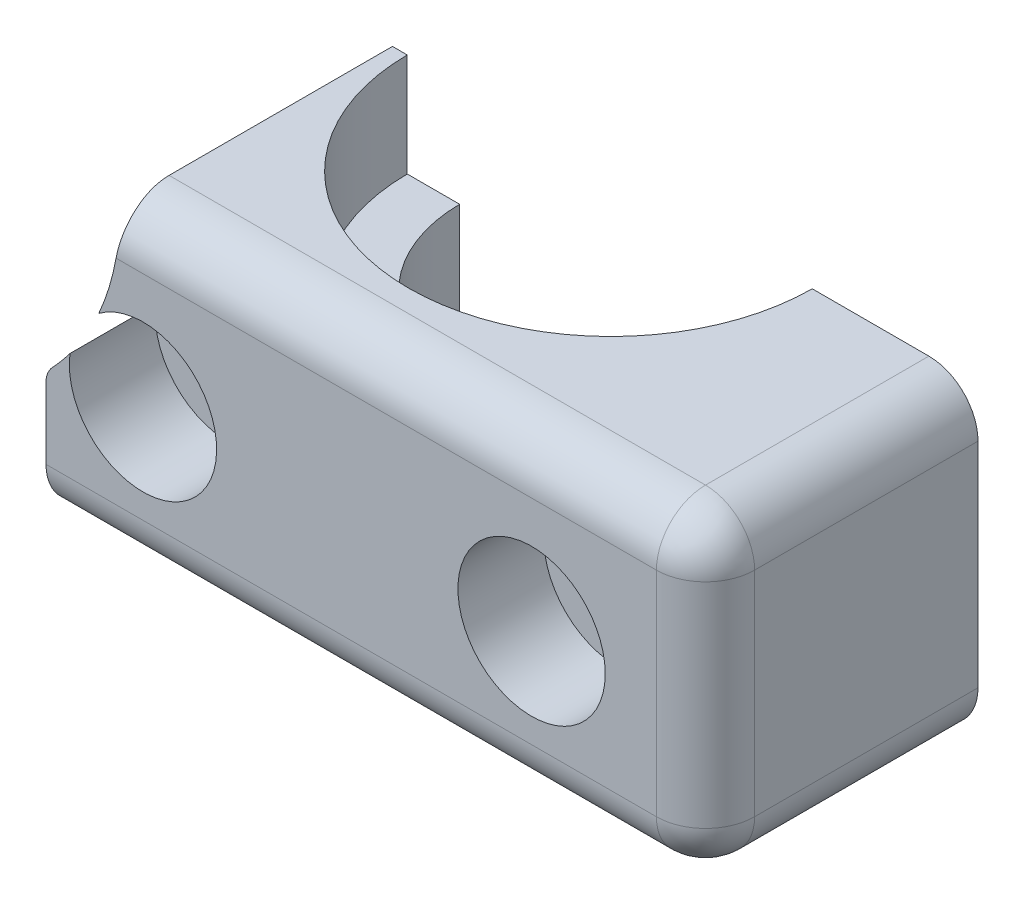
ISO-10303-21;
HEADER;
FILE_DESCRIPTION(('STEP AP214'),'2;1');
FILE_NAME('part.step','',(''),(''),'','','');
FILE_SCHEMA(('AUTOMOTIVE_DESIGN { 1 0 10303 214 1 1 1 1 }'));
ENDSEC;
DATA;
#1=APPLICATION_CONTEXT('core data for automotive mechanical design processes');
#2=APPLICATION_PROTOCOL_DEFINITION('international standard','automotive_design',2000,#1);
#3=PRODUCT_CONTEXT('',#1,'mechanical');
#4=PRODUCT('Part','Part','',(#3));
#5=PRODUCT_RELATED_PRODUCT_CATEGORY('part','',(#4));
#6=PRODUCT_DEFINITION_FORMATION('','',#4);
#7=PRODUCT_DEFINITION_CONTEXT('part definition',#1,'design');
#8=PRODUCT_DEFINITION('design','',#6,#7);
#9=PRODUCT_DEFINITION_SHAPE('','',#8);
#10=(LENGTH_UNIT() NAMED_UNIT(*) SI_UNIT(.MILLI.,.METRE.));
#11=(NAMED_UNIT(*) PLANE_ANGLE_UNIT() SI_UNIT($,.RADIAN.));
#12=(NAMED_UNIT(*) SI_UNIT($,.STERADIAN.) SOLID_ANGLE_UNIT());
#13=UNCERTAINTY_MEASURE_WITH_UNIT(LENGTH_MEASURE(1.E-05),#10,'distance_accuracy_value','');
#14=(GEOMETRIC_REPRESENTATION_CONTEXT(3) GLOBAL_UNCERTAINTY_ASSIGNED_CONTEXT((#13)) GLOBAL_UNIT_ASSIGNED_CONTEXT((#10,
#11,#12)) REPRESENTATION_CONTEXT('',''));
#15=CARTESIAN_POINT('',(0.,0.,0.));
#16=DIRECTION('',(0.,0.,1.));
#17=DIRECTION('',(1.,0.,0.));
#18=AXIS2_PLACEMENT_3D('',#15,#16,#17);
#19=CARTESIAN_POINT('',(4.42655787969391,-17.5520097629016,27.2355834067228));
#20=DIRECTION('',(0.,1.,0.));
#21=DIRECTION('',(0.,0.,1.));
#22=AXIS2_PLACEMENT_3D('',#19,#20,#21);
#23=CYLINDRICAL_SURFACE('',#22,6.1162230795646);
#24=DIRECTION('',(0.,1.,0.));
#25=VECTOR('',#24,1.);
#26=CARTESIAN_POINT('',(10.5425765813493,-17.5520097629016,27.2855834067228));
#27=LINE('',#26,#25);
#28=CARTESIAN_POINT('',(10.5425765813493,10.7825140162545,27.2855834067228));
#29=VERTEX_POINT('',#28);
#30=CARTESIAN_POINT('',(10.5425765813493,5.78251401625446,27.2855834067229));
#31=VERTEX_POINT('',#30);
#32=EDGE_CURVE('E301',#29,#31,#27,.F.);
#33=ORIENTED_EDGE('',*,*,#32,.T.);
#34=CARTESIAN_POINT('',(4.42655787969391,5.78251401625446,27.2355834067229));
#35=DIRECTION('',(0.,-1.,0.));
#36=DIRECTION('',(0.,0.,-1.));
#37=AXIS2_PLACEMENT_3D('',#34,#35,#36);
#38=CIRCLE('',#37,6.1162230795646);
#39=CARTESIAN_POINT('',(-1.68946082196149,5.78251401625446,27.2855834067229));
#40=VERTEX_POINT('',#39);
#41=EDGE_CURVE('E48',#31,#40,#38,.T.);
#42=ORIENTED_EDGE('',*,*,#41,.T.);
#43=DIRECTION('',(0.,1.,0.));
#44=VECTOR('',#43,1.);
#45=CARTESIAN_POINT('',(-1.68946082196149,-17.5520097629016,27.2855834067228));
#46=LINE('',#45,#44);
#47=CARTESIAN_POINT('',(-1.68946082196149,10.7825140162545,27.2855834067228));
#48=VERTEX_POINT('',#47);
#49=EDGE_CURVE('E292',#40,#48,#46,.T.);
#50=ORIENTED_EDGE('',*,*,#49,.T.);
#51=CARTESIAN_POINT('',(4.42655787969391,10.7825140162545,27.2355834067229));
#52=DIRECTION('',(0.,-1.,0.));
#53=DIRECTION('',(0.,0.,-1.));
#54=AXIS2_PLACEMENT_3D('',#51,#52,#53);
#55=CIRCLE('',#54,6.1162230795646);
#56=EDGE_CURVE('E320',#29,#48,#55,.T.);
#57=ORIENTED_EDGE('',*,*,#56,.F.);
#58=EDGE_LOOP('',(#33,#42,#50,#57));
#59=FACE_BOUND('',#58,.T.);
#60=ADVANCED_FACE('F45',(#59),#23,.F.);
#61=CARTESIAN_POINT('',(0.,5.78251401625447,0.));
#62=DIRECTION('',(0.,1.,0.));
#63=DIRECTION('',(0.,0.,1.));
#64=AXIS2_PLACEMENT_3D('',#61,#62,#63);
#65=PLANE('',#64);
#66=ORIENTED_EDGE('',*,*,#41,.F.);
#67=DIRECTION('',(-1.,0.,0.));
#68=VECTOR('',#67,1.);
#69=CARTESIAN_POINT('',(0.,5.78251401625446,27.2855834067229));
#70=LINE('',#69,#68);
#71=CARTESIAN_POINT('',(12.676406363151,5.78251401625446,27.2855834067229));
#72=VERTEX_POINT('',#71);
#73=EDGE_CURVE('E244',#72,#31,#70,.T.);
#74=ORIENTED_EDGE('',*,*,#73,.F.);
#75=CARTESIAN_POINT('',(4.42655787969391,5.78251401625446,27.2355834067229));
#76=DIRECTION('',(0.,1.,0.));
#77=DIRECTION('',(0.,0.,1.));
#78=AXIS2_PLACEMENT_3D('',#75,#76,#77);
#79=CIRCLE('',#78,8.25);
#80=CARTESIAN_POINT('',(-3.82329060376322,5.78251401625446,27.2855834067229));
#81=VERTEX_POINT('',#80);
#82=EDGE_CURVE('E322',#81,#72,#79,.T.);
#83=ORIENTED_EDGE('',*,*,#82,.F.);
#84=EDGE_CURVE('E271',#40,#81,#70,.T.);
#85=ORIENTED_EDGE('',*,*,#84,.F.);
#86=EDGE_LOOP('',(#66,#74,#83,#85));
#87=FACE_BOUND('',#86,.T.);
#88=ADVANCED_FACE('F413',(#87),#65,.F.);
#89=CARTESIAN_POINT('',(12.3417710075974,8.28251401625447,34.8855834067228));
#90=DIRECTION('',(0.,0.,1.));
#91=DIRECTION('',(1.,0.,0.));
#92=AXIS2_PLACEMENT_3D('',#89,#90,#91);
#93=PLANE('',#92);
#94=CARTESIAN_POINT('',(12.3417710075974,8.28251401625447,34.8855834067228));
#95=DIRECTION('',(0.,0.,1.));
#96=DIRECTION('',(1.,0.,0.));
#97=AXIS2_PLACEMENT_3D('',#94,#95,#96);
#98=CIRCLE('',#97,3.);
#99=CARTESIAN_POINT('',(15.3417710075974,8.28251401625447,34.8855834067228));
#100=VERTEX_POINT('',#99);
#101=EDGE_CURVE('E294',#100,#100,#98,.T.);
#102=ORIENTED_EDGE('',*,*,#101,.T.);
#103=EDGE_LOOP('',(#102));
#104=FACE_BOUND('',#103,.T.);
#105=CARTESIAN_POINT('',(12.3417710075974,8.28251401625447,34.8855834067228));
#106=DIRECTION('',(0.,0.,1.));
#107=DIRECTION('',(1.,0.,0.));
#108=AXIS2_PLACEMENT_3D('',#105,#106,#107);
#109=CIRCLE('',#108,1.75);
#110=CARTESIAN_POINT('',(14.0917710075974,8.28251401625447,34.8855834067228));
#111=VERTEX_POINT('',#110);
#112=EDGE_CURVE('E299',#111,#111,#109,.F.);
#113=ORIENTED_EDGE('',*,*,#112,.T.);
#114=EDGE_LOOP('',(#113));
#115=FACE_BOUND('',#114,.T.);
#116=ADVANCED_FACE('F431',(#104,#115),#93,.T.);
#117=CARTESIAN_POINT('',(12.3417710075974,8.28251401625447,22.285835938417));
#118=DIRECTION('',(0.,0.,1.));
#119=DIRECTION('',(1.,0.,0.));
#120=AXIS2_PLACEMENT_3D('',#117,#118,#119);
#121=CYLINDRICAL_SURFACE('',#120,1.75);
#122=ORIENTED_EDGE('',*,*,#112,.F.);
#123=EDGE_LOOP('',(#122));
#124=FACE_BOUND('',#123,.T.);
#125=CARTESIAN_POINT('',(12.3417710075974,8.28251401625447,27.2855834067229));
#126=DIRECTION('',(0.,0.,-1.));
#127=DIRECTION('',(0.,1.,0.));
#128=AXIS2_PLACEMENT_3D('',#125,#126,#127);
#129=CIRCLE('',#128,1.75);
#130=CARTESIAN_POINT('',(12.3417710075974,10.0325140162545,27.2855834067229));
#131=VERTEX_POINT('',#130);
#132=EDGE_CURVE('E283',#131,#131,#129,.F.);
#133=ORIENTED_EDGE('',*,*,#132,.F.);
#134=EDGE_LOOP('',(#133));
#135=FACE_BOUND('',#134,.T.);
#136=ADVANCED_FACE('F435',(#124,#135),#121,.F.);
#137=CARTESIAN_POINT('',(12.3417710075974,8.28251401625447,34.8855834067228));
#138=DIRECTION('',(0.,0.,1.));
#139=DIRECTION('',(1.,0.,0.));
#140=AXIS2_PLACEMENT_3D('',#137,#138,#139);
#141=CYLINDRICAL_SURFACE('',#140,3.);
#142=ORIENTED_EDGE('',*,*,#101,.F.);
#143=EDGE_LOOP('',(#142));
#144=FACE_BOUND('',#143,.T.);
#145=CARTESIAN_POINT('',(12.3417710075974,8.28251401625447,38.3855834067229));
#146=DIRECTION('',(0.,0.,1.));
#147=DIRECTION('',(1.,0.,0.));
#148=AXIS2_PLACEMENT_3D('',#145,#146,#147);
#149=CIRCLE('',#148,3.);
#150=CARTESIAN_POINT('',(15.3417710075974,8.28251401625447,38.3855834067229));
#151=VERTEX_POINT('',#150);
#152=EDGE_CURVE('E338',#151,#151,#149,.T.);
#153=ORIENTED_EDGE('',*,*,#152,.T.);
#154=EDGE_LOOP('',(#153));
#155=FACE_BOUND('',#154,.T.);
#156=ADVANCED_FACE('F442',(#144,#155),#141,.F.);
#157=CARTESIAN_POINT('',(-3.48865524820903,8.28251401625447,22.285835938417));
#158=DIRECTION('',(0.,0.,1.));
#159=DIRECTION('',(1.,0.,0.));
#160=AXIS2_PLACEMENT_3D('',#157,#158,#159);
#161=CYLINDRICAL_SURFACE('',#160,1.75);
#162=CARTESIAN_POINT('',(-3.48865524820903,8.28251401625447,34.8855834067228));
#163=DIRECTION('',(0.,0.,1.));
#164=DIRECTION('',(1.,0.,0.));
#165=AXIS2_PLACEMENT_3D('',#162,#163,#164);
#166=CIRCLE('',#165,1.75);
#167=CARTESIAN_POINT('',(-1.73865524820903,8.28251401625447,34.8855834067228));
#168=VERTEX_POINT('',#167);
#169=EDGE_CURVE('E329',#168,#168,#166,.F.);
#170=ORIENTED_EDGE('',*,*,#169,.F.);
#171=EDGE_LOOP('',(#170));
#172=FACE_BOUND('',#171,.T.);
#173=CARTESIAN_POINT('',(-3.48865524820903,8.28251401625447,27.2855834067229));
#174=DIRECTION('',(0.,0.,-1.));
#175=DIRECTION('',(0.,1.,0.));
#176=AXIS2_PLACEMENT_3D('',#173,#174,#175);
#177=CIRCLE('',#176,1.75);
#178=CARTESIAN_POINT('',(-3.48865524820903,10.0325140162545,27.2855834067229));
#179=VERTEX_POINT('',#178);
#180=EDGE_CURVE('E208',#179,#179,#177,.F.);
#181=ORIENTED_EDGE('',*,*,#180,.F.);
#182=EDGE_LOOP('',(#181));
#183=FACE_BOUND('',#182,.T.);
#184=ADVANCED_FACE('F439',(#172,#183),#161,.F.);
#185=CARTESIAN_POINT('',(-3.48865524820903,8.28251401625447,34.8855834067228));
#186=DIRECTION('',(0.,0.,1.));
#187=DIRECTION('',(1.,0.,0.));
#188=AXIS2_PLACEMENT_3D('',#185,#186,#187);
#189=CYLINDRICAL_SURFACE('',#188,3.);
#190=CARTESIAN_POINT('',(-3.48865524820903,8.28251401625447,34.8855834067228));
#191=DIRECTION('',(0.,0.,1.));
#192=DIRECTION('',(1.,0.,0.));
#193=AXIS2_PLACEMENT_3D('',#190,#191,#192);
#194=CIRCLE('',#193,3.);
#195=CARTESIAN_POINT('',(-6.46206836691554,8.68102929262916,34.8855834067228));
#196=VERTEX_POINT('',#195);
#197=CARTESIAN_POINT('',(-5.28823397862114,10.6828299106834,34.8855834067228));
#198=VERTEX_POINT('',#197);
#199=EDGE_CURVE('E341',#196,#198,#194,.T.);
#200=ORIENTED_EDGE('',*,*,#199,.F.);
#201=DIRECTION('',(0.,0.,-1.));
#202=VECTOR('',#201,1.);
#203=CARTESIAN_POINT('',(-6.46206836691554,8.68102929262916,32.8355834067229));
#204=LINE('',#203,#202);
#205=CARTESIAN_POINT('',(-6.46206836691554,8.68102929262916,38.3855834067229));
#206=VERTEX_POINT('',#205);
#207=EDGE_CURVE('E335',#196,#206,#204,.F.);
#208=ORIENTED_EDGE('',*,*,#207,.T.);
#209=CARTESIAN_POINT('',(-3.48865524820903,8.28251401625447,38.3855834067229));
#210=DIRECTION('',(0.,0.,1.));
#211=DIRECTION('',(1.,0.,0.));
#212=AXIS2_PLACEMENT_3D('',#209,#210,#211);
#213=CIRCLE('',#212,3.);
#214=CARTESIAN_POINT('',(-5.28823397862114,10.6828299106834,38.3855834067229));
#215=VERTEX_POINT('',#214);
#216=EDGE_CURVE('E318',#206,#215,#213,.T.);
#217=ORIENTED_EDGE('',*,*,#216,.T.);
#218=DIRECTION('',(0.,0.,-1.));
#219=VECTOR('',#218,1.);
#220=CARTESIAN_POINT('',(-5.28823397862114,10.6828299106834,32.8355834067229));
#221=LINE('',#220,#219);
#222=EDGE_CURVE('E339',#215,#198,#221,.T.);
#223=ORIENTED_EDGE('',*,*,#222,.T.);
#224=EDGE_LOOP('',(#200,#208,#217,#223));
#225=FACE_BOUND('',#224,.T.);
#226=ADVANCED_FACE('F372',(#225),#189,.F.);
#227=CARTESIAN_POINT('',(-3.48865524820903,8.28251401625447,34.8855834067228));
#228=DIRECTION('',(0.,0.,1.));
#229=DIRECTION('',(1.,0.,0.));
#230=AXIS2_PLACEMENT_3D('',#227,#228,#229);
#231=PLANE('',#230);
#232=CARTESIAN_POINT('',(-14.5734421203059,14.7825140162689,34.8855834067228));
#233=DIRECTION('',(0.,0.,1.));
#234=DIRECTION('',(1.,0.,0.));
#235=AXIS2_PLACEMENT_3D('',#232,#233,#234);
#236=CIRCLE('',#235,10.15);
#237=EDGE_CURVE('E277',#196,#198,#236,.T.);
#238=ORIENTED_EDGE('',*,*,#237,.F.);
#239=ORIENTED_EDGE('',*,*,#199,.T.);
#240=EDGE_LOOP('',(#238,#239));
#241=FACE_BOUND('',#240,.T.);
#242=ORIENTED_EDGE('',*,*,#169,.T.);
#243=EDGE_LOOP('',(#242));
#244=FACE_BOUND('',#243,.T.);
#245=ADVANCED_FACE('F449',(#241,#244),#231,.T.);
#246=CARTESIAN_POINT('',(19.4265578796941,2.28251401626882,113.118440972856));
#247=DIRECTION('',(1.,0.,0.));
#248=DIRECTION('',(0.,0.,-1.));
#249=AXIS2_PLACEMENT_3D('',#246,#247,#248);
#250=PLANE('',#249);
#251=DIRECTION('',(0.,1.,0.));
#252=VECTOR('',#251,1.);
#253=CARTESIAN_POINT('',(19.4265578796941,14.9825140162688,27.2855834067229));
#254=LINE('',#253,#252);
#255=CARTESIAN_POINT('',(19.4265578796941,12.9825140162688,27.2855834067229));
#256=VERTEX_POINT('',#255);
#257=CARTESIAN_POINT('',(19.4265578796941,4.28251401626883,27.2855834067229));
#258=VERTEX_POINT('',#257);
#259=EDGE_CURVE('E212',#256,#258,#254,.F.);
#260=ORIENTED_EDGE('',*,*,#259,.F.);
#261=DIRECTION('',(0.,0.,1.));
#262=VECTOR('',#261,1.);
#263=CARTESIAN_POINT('',(19.4265578796941,12.9825140162688,113.118440972856));
#264=LINE('',#263,#262);
#265=CARTESIAN_POINT('',(19.4265578796941,12.9825140162688,36.3855834067229));
#266=VERTEX_POINT('',#265);
#267=EDGE_CURVE('E349',#256,#266,#264,.T.);
#268=ORIENTED_EDGE('',*,*,#267,.T.);
#269=DIRECTION('',(0.,-1.,0.));
#270=VECTOR('',#269,1.);
#271=CARTESIAN_POINT('',(19.4265578796941,2.28251401626882,36.3855834067229));
#272=LINE('',#271,#270);
#273=CARTESIAN_POINT('',(19.4265578796941,4.28251401626883,36.3855834067229));
#274=VERTEX_POINT('',#273);
#275=EDGE_CURVE('E352',#266,#274,#272,.T.);
#276=ORIENTED_EDGE('',*,*,#275,.T.);
#277=DIRECTION('',(0.,0.,-1.));
#278=VECTOR('',#277,1.);
#279=CARTESIAN_POINT('',(19.4265578796941,4.28251401626882,113.118440972856));
#280=LINE('',#279,#278);
#281=EDGE_CURVE('E176',#274,#258,#280,.T.);
#282=ORIENTED_EDGE('',*,*,#281,.T.);
#283=EDGE_LOOP('',(#260,#268,#276,#282));
#284=FACE_BOUND('',#283,.T.);
#285=ADVANCED_FACE('F396',(#284),#250,.T.);
#286=CARTESIAN_POINT('',(19.4265578796941,2.28251401626882,113.118440972856));
#287=DIRECTION('',(0.,-1.,0.));
#288=DIRECTION('',(0.,0.,-1.));
#289=AXIS2_PLACEMENT_3D('',#286,#287,#288);
#290=PLANE('',#289);
#291=DIRECTION('',(1.,0.,0.));
#292=VECTOR('',#291,1.);
#293=CARTESIAN_POINT('',(19.4265578796941,2.28251401626884,27.2855834067229));
#294=LINE('',#293,#292);
#295=CARTESIAN_POINT('',(17.4265578796941,2.28251401626884,27.2855834067229));
#296=VERTEX_POINT('',#295);
#297=CARTESIAN_POINT('',(12.6764063631511,2.28251401626884,27.2855834067229));
#298=VERTEX_POINT('',#297);
#299=EDGE_CURVE('E172',#296,#298,#294,.F.);
#300=ORIENTED_EDGE('',*,*,#299,.F.);
#301=DIRECTION('',(0.,0.,-1.));
#302=VECTOR('',#301,1.);
#303=CARTESIAN_POINT('',(17.4265578796941,2.28251401626882,113.118440972856));
#304=LINE('',#303,#302);
#305=CARTESIAN_POINT('',(17.4265578796941,2.28251401626883,36.3855834067229));
#306=VERTEX_POINT('',#305);
#307=EDGE_CURVE('E166',#296,#306,#304,.F.);
#308=ORIENTED_EDGE('',*,*,#307,.T.);
#309=DIRECTION('',(-1.,0.,0.));
#310=VECTOR('',#309,1.);
#311=CARTESIAN_POINT('',(19.4265578796941,2.28251401626883,36.3855834067229));
#312=LINE('',#311,#310);
#313=CARTESIAN_POINT('',(-7.43865524820903,2.28251401626884,36.3855834067229));
#314=VERTEX_POINT('',#313);
#315=EDGE_CURVE('E169',#306,#314,#312,.T.);
#316=ORIENTED_EDGE('',*,*,#315,.T.);
#317=DIRECTION('',(0.,0.,1.));
#318=VECTOR('',#317,1.);
#319=CARTESIAN_POINT('',(-7.43865524820903,2.28251401626884,38.3855834067229));
#320=LINE('',#319,#318);
#321=CARTESIAN_POINT('',(-7.43865524820903,2.28251401626884,27.2855834067229));
#322=VERTEX_POINT('',#321);
#323=EDGE_CURVE('E187',#314,#322,#320,.F.);
#324=ORIENTED_EDGE('',*,*,#323,.T.);
#325=CARTESIAN_POINT('',(-3.82329060376322,2.28251401626884,27.2855834067229));
#326=VERTEX_POINT('',#325);
#327=EDGE_CURVE('E245',#326,#322,#294,.F.);
#328=ORIENTED_EDGE('',*,*,#327,.F.);
#329=CARTESIAN_POINT('',(4.42655787969391,2.28251401626883,27.2355834067229));
#330=DIRECTION('',(0.,-1.,0.));
#331=DIRECTION('',(0.,0.,-1.));
#332=AXIS2_PLACEMENT_3D('',#329,#330,#331);
#333=CIRCLE('',#332,8.25);
#334=EDGE_CURVE('E259',#326,#298,#333,.F.);
#335=ORIENTED_EDGE('',*,*,#334,.T.);
#336=EDGE_LOOP('',(#300,#308,#316,#324,#328,#335));
#337=FACE_BOUND('',#336,.T.);
#338=ADVANCED_FACE('F168',(#337),#290,.T.);
#339=CARTESIAN_POINT('',(11.8546881565214,1.47626687487991,38.3855834067229));
#340=DIRECTION('',(0.,0.,1.));
#341=DIRECTION('',(1.,0.,0.));
#342=AXIS2_PLACEMENT_3D('',#339,#340,#341);
#343=PLANE('',#342);
#344=DIRECTION('',(0.,-1.,0.));
#345=VECTOR('',#344,1.);
#346=CARTESIAN_POINT('',(17.4265578796941,1.47626687487991,38.3855834067229));
#347=LINE('',#346,#345);
#348=CARTESIAN_POINT('',(17.4265578796941,4.28251401626883,38.3855834067229));
#349=VERTEX_POINT('',#348);
#350=CARTESIAN_POINT('',(17.4265578796941,12.9825140162688,38.3855834067229));
#351=VERTEX_POINT('',#350);
#352=EDGE_CURVE('E326',#349,#351,#347,.F.);
#353=ORIENTED_EDGE('',*,*,#352,.T.);
#354=DIRECTION('',(-1.,0.,0.));
#355=VECTOR('',#354,1.);
#356=CARTESIAN_POINT('',(11.8546881565214,12.9825140162688,38.3855834067229));
#357=LINE('',#356,#355);
#358=CARTESIAN_POINT('',(-4.58432304002666,12.9825140162688,38.3855834067229));
#359=VERTEX_POINT('',#358);
#360=EDGE_CURVE('E361',#351,#359,#357,.T.);
#361=ORIENTED_EDGE('',*,*,#360,.T.);
#362=CARTESIAN_POINT('',(-14.5734421203059,14.7825140162689,38.3855834067229));
#363=DIRECTION('',(0.,0.,-1.));
#364=DIRECTION('',(-1.,0.,0.));
#365=AXIS2_PLACEMENT_3D('',#362,#363,#364);
#366=CIRCLE('',#365,10.15);
#367=EDGE_CURVE('E252',#359,#215,#366,.T.);
#368=ORIENTED_EDGE('',*,*,#367,.T.);
#369=ORIENTED_EDGE('',*,*,#216,.F.);
#370=CARTESIAN_POINT('',(-7.18059646699209,7.82777943137795,38.3855834067229));
#371=VERTEX_POINT('',#370);
#372=EDGE_CURVE('E248',#206,#371,#366,.T.);
#373=ORIENTED_EDGE('',*,*,#372,.T.);
#374=CARTESIAN_POINT('',(-6.48865524820903,7.17684368205318,38.3855834067229));
#375=DIRECTION('',(0.,0.,-1.));
#376=DIRECTION('',(-1.,0.,0.));
#377=AXIS2_PLACEMENT_3D('',#374,#375,#376);
#378=CIRCLE('',#377,0.95);
#379=CARTESIAN_POINT('',(-7.43865524820903,7.17684368205318,38.3855834067229));
#380=VERTEX_POINT('',#379);
#381=EDGE_CURVE('E251',#371,#380,#378,.F.);
#382=ORIENTED_EDGE('',*,*,#381,.T.);
#383=DIRECTION('',(0.,1.,0.));
#384=VECTOR('',#383,1.);
#385=CARTESIAN_POINT('',(-7.43865524820903,7.17684368205318,38.3855834067229));
#386=LINE('',#385,#384);
#387=CARTESIAN_POINT('',(-7.43865524820903,4.28251401626883,38.3855834067229));
#388=VERTEX_POINT('',#387);
#389=EDGE_CURVE('E255',#380,#388,#386,.F.);
#390=ORIENTED_EDGE('',*,*,#389,.T.);
#391=DIRECTION('',(-1.,0.,0.));
#392=VECTOR('',#391,1.);
#393=CARTESIAN_POINT('',(11.8546881565214,4.28251401626883,38.3855834067229));
#394=LINE('',#393,#392);
#395=EDGE_CURVE('E219',#388,#349,#394,.F.);
#396=ORIENTED_EDGE('',*,*,#395,.T.);
#397=EDGE_LOOP('',(#353,#361,#368,#369,#373,#382,#390,#396));
#398=FACE_BOUND('',#397,.T.);
#399=ORIENTED_EDGE('',*,*,#152,.F.);
#400=EDGE_LOOP('',(#399));
#401=FACE_BOUND('',#400,.T.);
#402=ADVANCED_FACE('F375',(#398,#401),#343,.T.);
#403=CARTESIAN_POINT('',(11.8546881565214,14.9825140162688,25.9373592877478));
#404=DIRECTION('',(0.,1.,0.));
#405=DIRECTION('',(0.,0.,1.));
#406=AXIS2_PLACEMENT_3D('',#403,#404,#405);
#407=PLANE('',#406);
#408=DIRECTION('',(0.,0.,-1.));
#409=VECTOR('',#408,1.);
#410=CARTESIAN_POINT('',(-4.42541275495624,14.9825140162688,38.3855834067229));
#411=LINE('',#410,#409);
#412=CARTESIAN_POINT('',(-4.42541275495624,14.9825140162688,36.3855834067229));
#413=VERTEX_POINT('',#412);
#414=CARTESIAN_POINT('',(-4.42542253567987,14.9827615410213,27.2855834067229));
#415=VERTEX_POINT('',#414);
#416=EDGE_CURVE('E362',#413,#415,#411,.T.);
#417=ORIENTED_EDGE('',*,*,#416,.F.);
#418=DIRECTION('',(-1.,0.,0.));
#419=VECTOR('',#418,1.);
#420=CARTESIAN_POINT('',(11.8546881565214,14.9825140162688,36.3855834067229));
#421=LINE('',#420,#419);
#422=CARTESIAN_POINT('',(17.4265578796941,14.9825140162688,36.3855834067229));
#423=VERTEX_POINT('',#422);
#424=EDGE_CURVE('E216',#413,#423,#421,.F.);
#425=ORIENTED_EDGE('',*,*,#424,.T.);
#426=DIRECTION('',(0.,0.,1.));
#427=VECTOR('',#426,1.);
#428=CARTESIAN_POINT('',(17.4265578796941,14.9825140162688,25.9373592877478));
#429=LINE('',#428,#427);
#430=CARTESIAN_POINT('',(17.4265578796941,14.9825140162688,27.2855834067229));
#431=VERTEX_POINT('',#430);
#432=EDGE_CURVE('E218',#423,#431,#429,.F.);
#433=ORIENTED_EDGE('',*,*,#432,.T.);
#434=DIRECTION('',(1.,0.,0.));
#435=VECTOR('',#434,1.);
#436=CARTESIAN_POINT('',(19.4265578796941,14.9825140162688,27.2855834067229));
#437=LINE('',#436,#435);
#438=CARTESIAN_POINT('',(12.6764063631511,14.9825140162688,27.2855834067229));
#439=VERTEX_POINT('',#438);
#440=EDGE_CURVE('E221',#431,#439,#437,.F.);
#441=ORIENTED_EDGE('',*,*,#440,.T.);
#442=CARTESIAN_POINT('',(4.42655787969391,14.9825140162688,27.2355834067229));
#443=DIRECTION('',(0.,1.,0.));
#444=DIRECTION('',(0.,0.,1.));
#445=AXIS2_PLACEMENT_3D('',#442,#443,#444);
#446=CIRCLE('',#445,8.25);
#447=CARTESIAN_POINT('',(-3.82329060376321,14.9825140162688,27.2855834067229));
#448=VERTEX_POINT('',#447);
#449=EDGE_CURVE('E315',#448,#439,#446,.T.);
#450=ORIENTED_EDGE('',*,*,#449,.F.);
#451=EDGE_CURVE('E224',#448,#415,#437,.F.);
#452=ORIENTED_EDGE('',*,*,#451,.T.);
#453=EDGE_LOOP('',(#417,#425,#433,#441,#450,#452));
#454=FACE_BOUND('',#453,.T.);
#455=ADVANCED_FACE('F387',(#454),#407,.T.);
#456=CARTESIAN_POINT('',(4.42655787969391,10.7825140162545,27.2355834067229));
#457=DIRECTION('',(0.,-1.,0.));
#458=DIRECTION('',(0.,0.,-1.));
#459=AXIS2_PLACEMENT_3D('',#456,#457,#458);
#460=PLANE('',#459);
#461=DIRECTION('',(1.,0.,0.));
#462=VECTOR('',#461,1.);
#463=CARTESIAN_POINT('',(4.42655787969391,10.7825140162545,27.2855834067229));
#464=LINE('',#463,#462);
#465=CARTESIAN_POINT('',(-3.82329060376322,10.7825140162545,27.2855834067229));
#466=VERTEX_POINT('',#465);
#467=EDGE_CURVE('E273',#466,#48,#464,.T.);
#468=ORIENTED_EDGE('',*,*,#467,.F.);
#469=CARTESIAN_POINT('',(4.42655787969391,10.7825140162545,27.2355834067229));
#470=DIRECTION('',(0.,-1.,0.));
#471=DIRECTION('',(0.,0.,-1.));
#472=AXIS2_PLACEMENT_3D('',#469,#470,#471);
#473=CIRCLE('',#472,8.25);
#474=CARTESIAN_POINT('',(12.6764063631511,10.7825140162545,27.2855834067229));
#475=VERTEX_POINT('',#474);
#476=EDGE_CURVE('E307',#475,#466,#473,.T.);
#477=ORIENTED_EDGE('',*,*,#476,.F.);
#478=EDGE_CURVE('E279',#29,#475,#464,.T.);
#479=ORIENTED_EDGE('',*,*,#478,.F.);
#480=ORIENTED_EDGE('',*,*,#56,.T.);
#481=EDGE_LOOP('',(#468,#477,#479,#480));
#482=FACE_BOUND('',#481,.T.);
#483=ADVANCED_FACE('F411',(#482),#460,.F.);
#484=CARTESIAN_POINT('',(4.42655787969392,33.2835140162685,27.2355834067229));
#485=DIRECTION('',(0.,-1.,0.));
#486=DIRECTION('',(0.,0.,-1.));
#487=AXIS2_PLACEMENT_3D('',#484,#485,#486);
#488=CYLINDRICAL_SURFACE('',#487,8.25);
#489=ORIENTED_EDGE('',*,*,#82,.T.);
#490=DIRECTION('',(0.,-1.,0.));
#491=VECTOR('',#490,1.);
#492=CARTESIAN_POINT('',(12.6764063631511,33.2835140162685,27.2855834067229));
#493=LINE('',#492,#491);
#494=EDGE_CURVE('E304',#72,#298,#493,.T.);
#495=ORIENTED_EDGE('',*,*,#494,.T.);
#496=ORIENTED_EDGE('',*,*,#334,.F.);
#497=DIRECTION('',(0.,-1.,0.));
#498=VECTOR('',#497,1.);
#499=CARTESIAN_POINT('',(-3.82329060376322,33.2835140162685,27.2855834067229));
#500=LINE('',#499,#498);
#501=EDGE_CURVE('E290',#326,#81,#500,.F.);
#502=ORIENTED_EDGE('',*,*,#501,.T.);
#503=EDGE_LOOP('',(#489,#495,#496,#502));
#504=FACE_BOUND('',#503,.T.);
#505=ADVANCED_FACE('F416',(#504),#488,.F.);
#506=ORIENTED_EDGE('',*,*,#449,.T.);
#507=DIRECTION('',(0.,-1.,0.));
#508=VECTOR('',#507,1.);
#509=CARTESIAN_POINT('',(12.6764063631511,33.2835140162685,27.2855834067229));
#510=LINE('',#509,#508);
#511=EDGE_CURVE('E312',#439,#475,#510,.T.);
#512=ORIENTED_EDGE('',*,*,#511,.T.);
#513=ORIENTED_EDGE('',*,*,#476,.T.);
#514=DIRECTION('',(0.,-1.,0.));
#515=VECTOR('',#514,1.);
#516=CARTESIAN_POINT('',(-3.82329060376322,33.2835140162685,27.2855834067229));
#517=LINE('',#516,#515);
#518=EDGE_CURVE('E213',#466,#448,#517,.F.);
#519=ORIENTED_EDGE('',*,*,#518,.T.);
#520=EDGE_LOOP('',(#506,#512,#513,#519));
#521=FACE_BOUND('',#520,.T.);
#522=ADVANCED_FACE('F408',(#521),#488,.F.);
#523=CARTESIAN_POINT('',(19.4265578796941,14.9825140162688,27.2855834067229));
#524=DIRECTION('',(0.,0.,-1.));
#525=DIRECTION('',(0.,1.,0.));
#526=AXIS2_PLACEMENT_3D('',#523,#524,#525);
#527=PLANE('',#526);
#528=ORIENTED_EDGE('',*,*,#440,.F.);
#529=CARTESIAN_POINT('',(17.4265578796941,12.9825140162688,27.2855834067229));
#530=DIRECTION('',(0.,0.,-1.));
#531=DIRECTION('',(0.,1.,0.));
#532=AXIS2_PLACEMENT_3D('',#529,#530,#531);
#533=CIRCLE('',#532,2.);
#534=EDGE_CURVE('E210',#431,#256,#533,.T.);
#535=ORIENTED_EDGE('',*,*,#534,.T.);
#536=ORIENTED_EDGE('',*,*,#259,.T.);
#537=CARTESIAN_POINT('',(17.4265578796941,4.28251401626883,27.2855834067229));
#538=DIRECTION('',(0.,0.,-1.));
#539=DIRECTION('',(0.,1.,0.));
#540=AXIS2_PLACEMENT_3D('',#537,#538,#539);
#541=CIRCLE('',#540,2.);
#542=EDGE_CURVE('E214',#258,#296,#541,.T.);
#543=ORIENTED_EDGE('',*,*,#542,.T.);
#544=ORIENTED_EDGE('',*,*,#299,.T.);
#545=ORIENTED_EDGE('',*,*,#494,.F.);
#546=ORIENTED_EDGE('',*,*,#73,.T.);
#547=ORIENTED_EDGE('',*,*,#32,.F.);
#548=ORIENTED_EDGE('',*,*,#478,.T.);
#549=ORIENTED_EDGE('',*,*,#511,.F.);
#550=EDGE_LOOP('',(#528,#535,#536,#543,#544,#545,#546,#547,#548,#549));
#551=FACE_BOUND('',#550,.T.);
#552=ORIENTED_EDGE('',*,*,#132,.T.);
#553=EDGE_LOOP('',(#552));
#554=FACE_BOUND('',#553,.T.);
#555=ADVANCED_FACE('F394',(#551,#554),#527,.T.);
#556=CARTESIAN_POINT('',(-14.5734421203059,14.7825140162689,38.3855834067229));
#557=DIRECTION('',(0.,0.,-1.));
#558=DIRECTION('',(-1.,0.,0.));
#559=AXIS2_PLACEMENT_3D('',#556,#557,#558);
#560=CYLINDRICAL_SURFACE('',#559,10.15);
#561=ORIENTED_EDGE('',*,*,#367,.F.);
#562=CARTESIAN_POINT('',(-4.58432304002666,12.9825140162688,38.3855834067229));
#563=CARTESIAN_POINT('',(-4.57439850244711,13.0375767051,38.3855831684427));
#564=CARTESIAN_POINT('',(-4.56493886059333,13.0926987749774,38.383307822671));
#565=CARTESIAN_POINT('',(-4.54698384800543,13.2027243257434,38.3741905248295));
#566=CARTESIAN_POINT('',(-4.53848852849076,13.2576277948717,38.3673483303267));
#567=CARTESIAN_POINT('',(-4.51452691015471,13.4213272015429,38.3399753728754));
#568=CARTESIAN_POINT('',(-4.50055417613797,13.5292838086846,38.3125983137435));
#569=CARTESIAN_POINT('',(-4.47660748821928,13.7395971746146,38.2400982862177));
#570=CARTESIAN_POINT('',(-4.46663744866556,13.8419483676703,38.1949580316789));
#571=CARTESIAN_POINT('',(-4.45031459536937,14.037896197028,38.0881139134438));
#572=CARTESIAN_POINT('',(-4.4439606540233,14.1314955547876,38.0264152219862));
#573=CARTESIAN_POINT('',(-4.434231160947,14.3065420276867,37.8886702178716));
#574=CARTESIAN_POINT('',(-4.43083476288641,14.3880707805984,37.8127289893316));
#575=CARTESIAN_POINT('',(-4.42612508704558,14.5374510122096,37.6483219657518));
#576=CARTESIAN_POINT('',(-4.42481236201938,14.6052988574903,37.5598528541087));
#577=CARTESIAN_POINT('',(-4.42342020797657,14.7257619093943,37.3722915598005));
#578=CARTESIAN_POINT('',(-4.42334868912267,14.7782773207416,37.2731352918917));
#579=CARTESIAN_POINT('',(-4.42369024311041,14.8659999794995,37.0674660815686));
#580=CARTESIAN_POINT('',(-4.42410307976367,14.9012156509808,36.9609567485892));
#581=CARTESIAN_POINT('',(-4.42473609096011,14.9456314966691,36.7759076474382));
#582=CARTESIAN_POINT('',(-4.42497708889115,14.9594501163001,36.6984434551461));
#583=CARTESIAN_POINT('',(-4.42532168425768,14.9778929947039,36.5425242693655));
#584=CARTESIAN_POINT('',(-4.42542544908153,14.9825284579612,36.4640706009738));
#585=CARTESIAN_POINT('',(-4.42541275495624,14.9825140162688,36.3855834067229));
#586=B_SPLINE_CURVE_WITH_KNOTS('',3,(#562,#563,#564,#565,#566,#567,#568,#569,#570,#571,#572,
#573,#574,#575,#576,#577,#578,#579,#580,#581,#582,#583,#584,#585),.UNSPECIFIED.,.F.,.F.,(4,2,2,
2,2,2,2,2,2,2,2,4),(0.,0.167752256599537,0.335513419103906,0.670519116458812,1.00585163198928,
1.34107952380594,1.67392496847229,2.00685869519239,2.34191342304292,2.67680483459362,
2.91235265074207,3.14761289460158),.UNSPECIFIED.);
#587=EDGE_CURVE('E225',#359,#413,#586,.T.);
#588=ORIENTED_EDGE('',*,*,#587,.T.);
#589=ORIENTED_EDGE('',*,*,#416,.T.);
#590=CARTESIAN_POINT('',(-14.5734421203059,14.7825140162689,27.2855834067229));
#591=DIRECTION('',(0.,0.,-1.));
#592=DIRECTION('',(0.,1.,0.));
#593=AXIS2_PLACEMENT_3D('',#590,#591,#592);
#594=CIRCLE('',#593,10.15);
#595=CARTESIAN_POINT('',(-7.18059646699209,7.82777943137795,27.2855834067229));
#596=VERTEX_POINT('',#595);
#597=EDGE_CURVE('E239',#596,#415,#594,.F.);
#598=ORIENTED_EDGE('',*,*,#597,.F.);
#599=DIRECTION('',(0.,0.,-1.));
#600=VECTOR('',#599,1.);
#601=CARTESIAN_POINT('',(-7.18059646699209,7.82777943137795,38.3855834067229));
#602=LINE('',#601,#600);
#603=EDGE_CURVE('E260',#371,#596,#602,.T.);
#604=ORIENTED_EDGE('',*,*,#603,.F.);
#605=ORIENTED_EDGE('',*,*,#372,.F.);
#606=ORIENTED_EDGE('',*,*,#207,.F.);
#607=ORIENTED_EDGE('',*,*,#237,.T.);
#608=ORIENTED_EDGE('',*,*,#222,.F.);
#609=EDGE_LOOP('',(#561,#588,#589,#598,#604,#605,#606,#607,#608));
#610=FACE_BOUND('',#609,.T.);
#611=ADVANCED_FACE('F369',(#610),#560,.F.);
#612=ORIENTED_EDGE('',*,*,#467,.T.);
#613=ORIENTED_EDGE('',*,*,#49,.F.);
#614=ORIENTED_EDGE('',*,*,#84,.T.);
#615=ORIENTED_EDGE('',*,*,#501,.F.);
#616=ORIENTED_EDGE('',*,*,#327,.T.);
#617=DIRECTION('',(0.,1.,0.));
#618=VECTOR('',#617,1.);
#619=CARTESIAN_POINT('',(-7.43865524820903,7.17684368205318,27.2855834067229));
#620=LINE('',#619,#618);
#621=CARTESIAN_POINT('',(-7.43865524820903,7.17684368205318,27.2855834067229));
#622=VERTEX_POINT('',#621);
#623=EDGE_CURVE('E265',#322,#622,#620,.T.);
#624=ORIENTED_EDGE('',*,*,#623,.T.);
#625=CARTESIAN_POINT('',(-6.48865524820903,7.17684368205318,27.2855834067229));
#626=DIRECTION('',(0.,0.,-1.));
#627=DIRECTION('',(0.,1.,0.));
#628=AXIS2_PLACEMENT_3D('',#625,#626,#627);
#629=CIRCLE('',#628,0.95);
#630=EDGE_CURVE('E242',#622,#596,#629,.T.);
#631=ORIENTED_EDGE('',*,*,#630,.T.);
#632=ORIENTED_EDGE('',*,*,#597,.T.);
#633=ORIENTED_EDGE('',*,*,#451,.F.);
#634=ORIENTED_EDGE('',*,*,#518,.F.);
#635=EDGE_LOOP('',(#612,#613,#614,#615,#616,#624,#631,#632,#633,#634));
#636=FACE_BOUND('',#635,.T.);
#637=ORIENTED_EDGE('',*,*,#180,.T.);
#638=EDGE_LOOP('',(#637));
#639=FACE_BOUND('',#638,.T.);
#640=ADVANCED_FACE('F406',(#636,#639),#527,.T.);
#641=CARTESIAN_POINT('',(-7.43865524820903,7.17684368205318,38.3855834067229));
#642=DIRECTION('',(1.,0.,0.));
#643=DIRECTION('',(0.,1.,0.));
#644=AXIS2_PLACEMENT_3D('',#641,#642,#643);
#645=PLANE('',#644);
#646=ORIENTED_EDGE('',*,*,#323,.F.);
#647=CARTESIAN_POINT('',(-7.43865524820903,4.28251401626883,36.3855834067229));
#648=DIRECTION('',(1.,0.,0.));
#649=DIRECTION('',(0.,1.,0.));
#650=AXIS2_PLACEMENT_3D('',#647,#648,#649);
#651=CIRCLE('',#650,2.);
#652=EDGE_CURVE('E186',#314,#388,#651,.F.);
#653=ORIENTED_EDGE('',*,*,#652,.T.);
#654=ORIENTED_EDGE('',*,*,#389,.F.);
#655=DIRECTION('',(0.,0.,-1.));
#656=VECTOR('',#655,1.);
#657=CARTESIAN_POINT('',(-7.43865524820903,7.17684368205318,38.3855834067229));
#658=LINE('',#657,#656);
#659=EDGE_CURVE('E207',#380,#622,#658,.T.);
#660=ORIENTED_EDGE('',*,*,#659,.T.);
#661=ORIENTED_EDGE('',*,*,#623,.F.);
#662=EDGE_LOOP('',(#646,#653,#654,#660,#661));
#663=FACE_BOUND('',#662,.T.);
#664=ADVANCED_FACE('F402',(#663),#645,.F.);
#665=CARTESIAN_POINT('',(-6.48865524820903,7.17684368205318,38.3855834067229));
#666=DIRECTION('',(0.,0.,-1.));
#667=DIRECTION('',(-1.,0.,0.));
#668=AXIS2_PLACEMENT_3D('',#665,#666,#667);
#669=CYLINDRICAL_SURFACE('',#668,0.95);
#670=ORIENTED_EDGE('',*,*,#659,.F.);
#671=ORIENTED_EDGE('',*,*,#381,.F.);
#672=ORIENTED_EDGE('',*,*,#603,.T.);
#673=ORIENTED_EDGE('',*,*,#630,.F.);
#674=EDGE_LOOP('',(#670,#671,#672,#673));
#675=FACE_BOUND('',#674,.T.);
#676=ADVANCED_FACE('F404',(#675),#669,.T.);
#677=CARTESIAN_POINT('',(11.8546881565214,12.9825140162688,36.3855834067229));
#678=DIRECTION('',(-1.,0.,0.));
#679=DIRECTION('',(0.,-1.,0.));
#680=AXIS2_PLACEMENT_3D('',#677,#678,#679);
#681=CYLINDRICAL_SURFACE('',#680,2.);
#682=ORIENTED_EDGE('',*,*,#587,.F.);
#683=ORIENTED_EDGE('',*,*,#360,.F.);
#684=CARTESIAN_POINT('',(17.4265578796941,12.9825140162688,36.3855834067229));
#685=DIRECTION('',(1.,0.,0.));
#686=DIRECTION('',(0.,0.,-1.));
#687=AXIS2_PLACEMENT_3D('',#684,#685,#686);
#688=CIRCLE('',#687,2.);
#689=EDGE_CURVE('E198',#423,#351,#688,.T.);
#690=ORIENTED_EDGE('',*,*,#689,.F.);
#691=ORIENTED_EDGE('',*,*,#424,.F.);
#692=EDGE_LOOP('',(#682,#683,#690,#691));
#693=FACE_BOUND('',#692,.T.);
#694=ADVANCED_FACE('F382',(#693),#681,.T.);
#695=CARTESIAN_POINT('',(17.4265578796941,12.9825140162688,113.118440972856));
#696=DIRECTION('',(0.,0.,1.));
#697=DIRECTION('',(1.,0.,0.));
#698=AXIS2_PLACEMENT_3D('',#695,#696,#697);
#699=CYLINDRICAL_SURFACE('',#698,2.);
#700=ORIENTED_EDGE('',*,*,#534,.F.);
#701=ORIENTED_EDGE('',*,*,#432,.F.);
#702=CARTESIAN_POINT('',(17.4265578796941,12.9825140162688,36.3855834067229));
#703=DIRECTION('',(0.,0.,1.));
#704=DIRECTION('',(1.,0.,0.));
#705=AXIS2_PLACEMENT_3D('',#702,#703,#704);
#706=CIRCLE('',#705,2.);
#707=EDGE_CURVE('E201',#266,#423,#706,.T.);
#708=ORIENTED_EDGE('',*,*,#707,.F.);
#709=ORIENTED_EDGE('',*,*,#267,.F.);
#710=EDGE_LOOP('',(#700,#701,#708,#709));
#711=FACE_BOUND('',#710,.T.);
#712=ADVANCED_FACE('F392',(#711),#699,.T.);
#713=CARTESIAN_POINT('',(17.4265578796941,4.28251401626882,113.118440972856));
#714=DIRECTION('',(0.,0.,-1.));
#715=DIRECTION('',(-1.,0.,0.));
#716=AXIS2_PLACEMENT_3D('',#713,#714,#715);
#717=CYLINDRICAL_SURFACE('',#716,2.);
#718=ORIENTED_EDGE('',*,*,#542,.F.);
#719=ORIENTED_EDGE('',*,*,#281,.F.);
#720=CARTESIAN_POINT('',(17.4265578796941,4.28251401626883,36.3855834067229));
#721=DIRECTION('',(0.,0.,1.));
#722=DIRECTION('',(1.,0.,0.));
#723=AXIS2_PLACEMENT_3D('',#720,#721,#722);
#724=CIRCLE('',#723,2.);
#725=EDGE_CURVE('E191',#306,#274,#724,.T.);
#726=ORIENTED_EDGE('',*,*,#725,.F.);
#727=ORIENTED_EDGE('',*,*,#307,.F.);
#728=EDGE_LOOP('',(#718,#719,#726,#727));
#729=FACE_BOUND('',#728,.T.);
#730=ADVANCED_FACE('F192',(#729),#717,.T.);
#731=CARTESIAN_POINT('',(19.4265578796941,4.28251401626883,36.3855834067229));
#732=DIRECTION('',(-1.,0.,0.));
#733=DIRECTION('',(0.,-1.,0.));
#734=AXIS2_PLACEMENT_3D('',#731,#732,#733);
#735=CYLINDRICAL_SURFACE('',#734,2.);
#736=ORIENTED_EDGE('',*,*,#652,.F.);
#737=ORIENTED_EDGE('',*,*,#315,.F.);
#738=CARTESIAN_POINT('',(17.4265578796941,4.28251401626883,36.3855834067229));
#739=DIRECTION('',(1.,0.,0.));
#740=DIRECTION('',(0.,0.,-1.));
#741=AXIS2_PLACEMENT_3D('',#738,#739,#740);
#742=CIRCLE('',#741,2.);
#743=EDGE_CURVE('E184',#349,#306,#742,.T.);
#744=ORIENTED_EDGE('',*,*,#743,.F.);
#745=ORIENTED_EDGE('',*,*,#395,.F.);
#746=EDGE_LOOP('',(#736,#737,#744,#745));
#747=FACE_BOUND('',#746,.T.);
#748=ADVANCED_FACE('F181',(#747),#735,.T.);
#749=CARTESIAN_POINT('',(17.4265578796941,12.9825140162688,36.3855834067229));
#750=DIRECTION('',(0.,0.,1.));
#751=DIRECTION('',(1.,0.,0.));
#752=AXIS2_PLACEMENT_3D('',#749,#750,#751);
#753=SPHERICAL_SURFACE('',#752,2.);
#754=ORIENTED_EDGE('',*,*,#707,.T.);
#755=ORIENTED_EDGE('',*,*,#689,.T.);
#756=CARTESIAN_POINT('',(17.4265578796941,12.9825140162688,36.3855834067229));
#757=DIRECTION('',(0.,1.,0.));
#758=DIRECTION('',(0.,0.,1.));
#759=AXIS2_PLACEMENT_3D('',#756,#757,#758);
#760=CIRCLE('',#759,2.);
#761=EDGE_CURVE('E54',#266,#351,#760,.F.);
#762=ORIENTED_EDGE('',*,*,#761,.F.);
#763=EDGE_LOOP('',(#754,#755,#762));
#764=FACE_BOUND('',#763,.T.);
#765=ADVANCED_FACE('F463',(#764),#753,.T.);
#766=CARTESIAN_POINT('',(17.4265578796941,4.28251401626883,36.3855834067229));
#767=DIRECTION('',(0.,0.,1.));
#768=DIRECTION('',(1.,0.,0.));
#769=AXIS2_PLACEMENT_3D('',#766,#767,#768);
#770=SPHERICAL_SURFACE('',#769,2.);
#771=ORIENTED_EDGE('',*,*,#743,.T.);
#772=ORIENTED_EDGE('',*,*,#725,.T.);
#773=CARTESIAN_POINT('',(17.4265578796941,4.28251401626883,36.3855834067229));
#774=DIRECTION('',(0.,-1.,0.));
#775=DIRECTION('',(0.,0.,-1.));
#776=AXIS2_PLACEMENT_3D('',#773,#774,#775);
#777=CIRCLE('',#776,2.);
#778=EDGE_CURVE('E12',#349,#274,#777,.F.);
#779=ORIENTED_EDGE('',*,*,#778,.F.);
#780=EDGE_LOOP('',(#771,#772,#779));
#781=FACE_BOUND('',#780,.T.);
#782=ADVANCED_FACE('F197',(#781),#770,.T.);
#783=CARTESIAN_POINT('',(17.4265578796941,2.28251401626882,36.3855834067229));
#784=DIRECTION('',(0.,-1.,0.));
#785=DIRECTION('',(1.,0.,0.));
#786=AXIS2_PLACEMENT_3D('',#783,#784,#785);
#787=CYLINDRICAL_SURFACE('',#786,2.);
#788=ORIENTED_EDGE('',*,*,#761,.T.);
#789=ORIENTED_EDGE('',*,*,#352,.F.);
#790=ORIENTED_EDGE('',*,*,#778,.T.);
#791=ORIENTED_EDGE('',*,*,#275,.F.);
#792=EDGE_LOOP('',(#788,#789,#790,#791));
#793=FACE_BOUND('',#792,.T.);
#794=ADVANCED_FACE('F399',(#793),#787,.T.);
#795=CLOSED_SHELL('',(#60,#88,#116,#136,#156,#184,#226,#245,#285,#338,#402,#455,#483,#505,#522,
#555,#611,#640,#664,#676,#694,#712,#730,#748,#765,#782,#794));
#796=MANIFOLD_SOLID_BREP('B2',#795);
#797=CARTESIAN_POINT('',(19.4265578796941,2.28251401626882,113.118440972856));
#798=DIRECTION('',(0.,-1.,0.));
#799=DIRECTION('',(0.,0.,-1.));
#800=AXIS2_PLACEMENT_3D('',#797,#798,#799);
#801=PLANE('',#800);
#802=DIRECTION('',(-0.999966584294501,0.,-0.00817497977911567));
#803=VECTOR('',#802,1.);
#804=CARTESIAN_POINT('',(11.2425531903555,2.28251401626883,27.2913058925682));
#805=LINE('',#804,#803);
#806=CARTESIAN_POINT('',(11.2425531903555,2.28251401626883,27.2913058925682));
#807=VERTEX_POINT('',#806);
#808=CARTESIAN_POINT('',(10.5425765813493,2.28251401626883,27.2855834067229));
#809=VERTEX_POINT('',#808);
#810=EDGE_CURVE('E709',#807,#809,#805,.T.);
#811=ORIENTED_EDGE('',*,*,#810,.F.);
#812=CARTESIAN_POINT('',(4.42655787969391,2.28251401626883,27.2355834067229));
#813=DIRECTION('',(0.,-1.,0.));
#814=DIRECTION('',(0.,0.,-1.));
#815=AXIS2_PLACEMENT_3D('',#812,#813,#814);
#816=CIRCLE('',#815,6.8162230795646);
#817=CARTESIAN_POINT('',(-2.38943743096765,2.28251401626883,27.2913058925682));
#818=VERTEX_POINT('',#817);
#819=EDGE_CURVE('E740',#807,#818,#816,.T.);
#820=ORIENTED_EDGE('',*,*,#819,.T.);
#821=DIRECTION('',(-0.999966584294501,0.,0.00817497977912062));
#822=VECTOR('',#821,1.);
#823=CARTESIAN_POINT('',(-1.6894608219615,2.28251401626883,27.2855834067229));
#824=LINE('',#823,#822);
#825=CARTESIAN_POINT('',(-1.68946082196149,2.28251401626883,27.2855834067229));
#826=VERTEX_POINT('',#825);
#827=EDGE_CURVE('E733',#826,#818,#824,.T.);
#828=ORIENTED_EDGE('',*,*,#827,.F.);
#829=CARTESIAN_POINT('',(4.42655787969391,2.28251401626883,27.2355834067229));
#830=DIRECTION('',(0.,-1.,0.));
#831=DIRECTION('',(0.,0.,-1.));
#832=AXIS2_PLACEMENT_3D('',#829,#830,#831);
#833=CIRCLE('',#832,6.1162230795646);
#834=EDGE_CURVE('E698',#809,#826,#833,.T.);
#835=ORIENTED_EDGE('',*,*,#834,.F.);
#836=EDGE_LOOP('',(#811,#820,#828,#835));
#837=FACE_BOUND('',#836,.T.);
#838=ADVANCED_FACE('F674',(#837),#801,.T.);
#839=CARTESIAN_POINT('',(4.42655787969391,-12.9363211251694,27.2355834067228));
#840=DIRECTION('',(0.,1.,0.));
#841=DIRECTION('',(0.,0.,1.));
#842=AXIS2_PLACEMENT_3D('',#839,#840,#841);
#843=CYLINDRICAL_SURFACE('',#842,6.8162230795646);
#844=DIRECTION('',(0.,1.,0.));
#845=VECTOR('',#844,1.);
#846=CARTESIAN_POINT('',(11.2425531903555,-12.9363211251694,27.2913058925682));
#847=LINE('',#846,#845);
#848=CARTESIAN_POINT('',(11.2425531903555,5.58251401625446,27.2913058925682));
#849=VERTEX_POINT('',#848);
#850=EDGE_CURVE('E43',#807,#849,#847,.T.);
#851=ORIENTED_EDGE('',*,*,#850,.T.);
#852=CARTESIAN_POINT('',(4.42655787969391,5.58251401625446,27.2355834067229));
#853=DIRECTION('',(0.,-1.,0.));
#854=DIRECTION('',(1.,0.,0.));
#855=AXIS2_PLACEMENT_3D('',#852,#853,#854);
#856=CIRCLE('',#855,6.8162230795646);
#857=CARTESIAN_POINT('',(-2.38943743096764,5.58251401625447,27.2913058925682));
#858=VERTEX_POINT('',#857);
#859=EDGE_CURVE('E713',#849,#858,#856,.T.);
#860=ORIENTED_EDGE('',*,*,#859,.T.);
#861=DIRECTION('',(0.,1.,0.));
#862=VECTOR('',#861,1.);
#863=CARTESIAN_POINT('',(-2.38943743096765,-12.9363211251694,27.2913058925682));
#864=LINE('',#863,#862);
#865=EDGE_CURVE('E682',#818,#858,#864,.T.);
#866=ORIENTED_EDGE('',*,*,#865,.F.);
#867=ORIENTED_EDGE('',*,*,#819,.F.);
#868=EDGE_LOOP('',(#851,#860,#866,#867));
#869=FACE_BOUND('',#868,.T.);
#870=ADVANCED_FACE('F747',(#869),#843,.T.);
#871=CARTESIAN_POINT('',(-1.6894608219615,-12.9363211251694,27.2855834067229));
#872=DIRECTION('',(-0.00817497977912062,0.,-0.999966584294501));
#873=DIRECTION('',(-0.999966584294501,0.,0.00817497977912062));
#874=AXIS2_PLACEMENT_3D('',#871,#872,#873);
#875=PLANE('',#874);
#876=DIRECTION('',(-0.999966584294501,0.,0.00817497977912062));
#877=VECTOR('',#876,1.);
#878=CARTESIAN_POINT('',(-1.68946082196149,5.58251401625446,27.2855834067229));
#879=LINE('',#878,#877);
#880=CARTESIAN_POINT('',(-1.68946082196149,5.58251401625446,27.2855834067229));
#881=VERTEX_POINT('',#880);
#882=EDGE_CURVE('E689',#881,#858,#879,.T.);
#883=ORIENTED_EDGE('',*,*,#882,.F.);
#884=DIRECTION('',(0.,1.,0.));
#885=VECTOR('',#884,1.);
#886=CARTESIAN_POINT('',(-1.6894608219615,-12.9363211251694,27.2855834067229));
#887=LINE('',#886,#885);
#888=EDGE_CURVE('E730',#826,#881,#887,.T.);
#889=ORIENTED_EDGE('',*,*,#888,.F.);
#890=ORIENTED_EDGE('',*,*,#827,.T.);
#891=ORIENTED_EDGE('',*,*,#865,.T.);
#892=EDGE_LOOP('',(#883,#889,#890,#891));
#893=FACE_BOUND('',#892,.T.);
#894=ADVANCED_FACE('F728',(#893),#875,.T.);
#895=CARTESIAN_POINT('',(11.2425531903555,-12.9363211251694,27.2913058925682));
#896=DIRECTION('',(0.00817497977911567,0.,-0.999966584294501));
#897=DIRECTION('',(-0.999966584294501,0.,-0.00817497977911567));
#898=AXIS2_PLACEMENT_3D('',#895,#896,#897);
#899=PLANE('',#898);
#900=DIRECTION('',(-0.999966584294501,0.,-0.00817497977911567));
#901=VECTOR('',#900,1.);
#902=CARTESIAN_POINT('',(11.2425531903555,5.58251401625446,27.2913058925682));
#903=LINE('',#902,#901);
#904=CARTESIAN_POINT('',(10.5425765813493,5.58251401625446,27.2855834067229));
#905=VERTEX_POINT('',#904);
#906=EDGE_CURVE('E716',#849,#905,#903,.T.);
#907=ORIENTED_EDGE('',*,*,#906,.F.);
#908=ORIENTED_EDGE('',*,*,#850,.F.);
#909=ORIENTED_EDGE('',*,*,#810,.T.);
#910=DIRECTION('',(0.,1.,0.));
#911=VECTOR('',#910,1.);
#912=CARTESIAN_POINT('',(10.5425765813493,-12.9363211251694,27.2855834067229));
#913=LINE('',#912,#911);
#914=EDGE_CURVE('E736',#809,#905,#913,.T.);
#915=ORIENTED_EDGE('',*,*,#914,.T.);
#916=EDGE_LOOP('',(#907,#908,#909,#915));
#917=FACE_BOUND('',#916,.T.);
#918=ADVANCED_FACE('F748',(#917),#899,.T.);
#919=CARTESIAN_POINT('',(4.42655787969391,-17.5520097629016,27.2355834067228));
#920=DIRECTION('',(0.,1.,0.));
#921=DIRECTION('',(0.,0.,1.));
#922=AXIS2_PLACEMENT_3D('',#919,#920,#921);
#923=CYLINDRICAL_SURFACE('',#922,6.1162230795646);
#924=CARTESIAN_POINT('',(4.42655787969391,5.58251401625446,27.2355834067229));
#925=DIRECTION('',(0.,-1.,0.));
#926=DIRECTION('',(0.,0.,-1.));
#927=AXIS2_PLACEMENT_3D('',#924,#925,#926);
#928=CIRCLE('',#927,6.1162230795646);
#929=EDGE_CURVE('E719',#905,#881,#928,.T.);
#930=ORIENTED_EDGE('',*,*,#929,.F.);
#931=ORIENTED_EDGE('',*,*,#914,.F.);
#932=ORIENTED_EDGE('',*,*,#834,.T.);
#933=ORIENTED_EDGE('',*,*,#888,.T.);
#934=EDGE_LOOP('',(#930,#931,#932,#933));
#935=FACE_BOUND('',#934,.T.);
#936=ADVANCED_FACE('F676',(#935),#923,.F.);
#937=CARTESIAN_POINT('',(4.42655787969391,5.58251401625446,27.2355834067229));
#938=DIRECTION('',(0.,-1.,0.));
#939=DIRECTION('',(1.,0.,0.));
#940=AXIS2_PLACEMENT_3D('',#937,#938,#939);
#941=PLANE('',#940);
#942=ORIENTED_EDGE('',*,*,#859,.F.);
#943=ORIENTED_EDGE('',*,*,#906,.T.);
#944=ORIENTED_EDGE('',*,*,#929,.T.);
#945=ORIENTED_EDGE('',*,*,#882,.T.);
#946=EDGE_LOOP('',(#942,#943,#944,#945));
#947=FACE_BOUND('',#946,.T.);
#948=ADVANCED_FACE('F720',(#947),#941,.F.);
#949=CLOSED_SHELL('',(#838,#870,#894,#918,#936,#948));
#950=MANIFOLD_SOLID_BREP('B6',#949);
#951=ADVANCED_BREP_SHAPE_REPRESENTATION('',(#18,#796,#950),#14);
#952=SHAPE_DEFINITION_REPRESENTATION(#9,#951);
ENDSEC;
END-ISO-10303-21;
